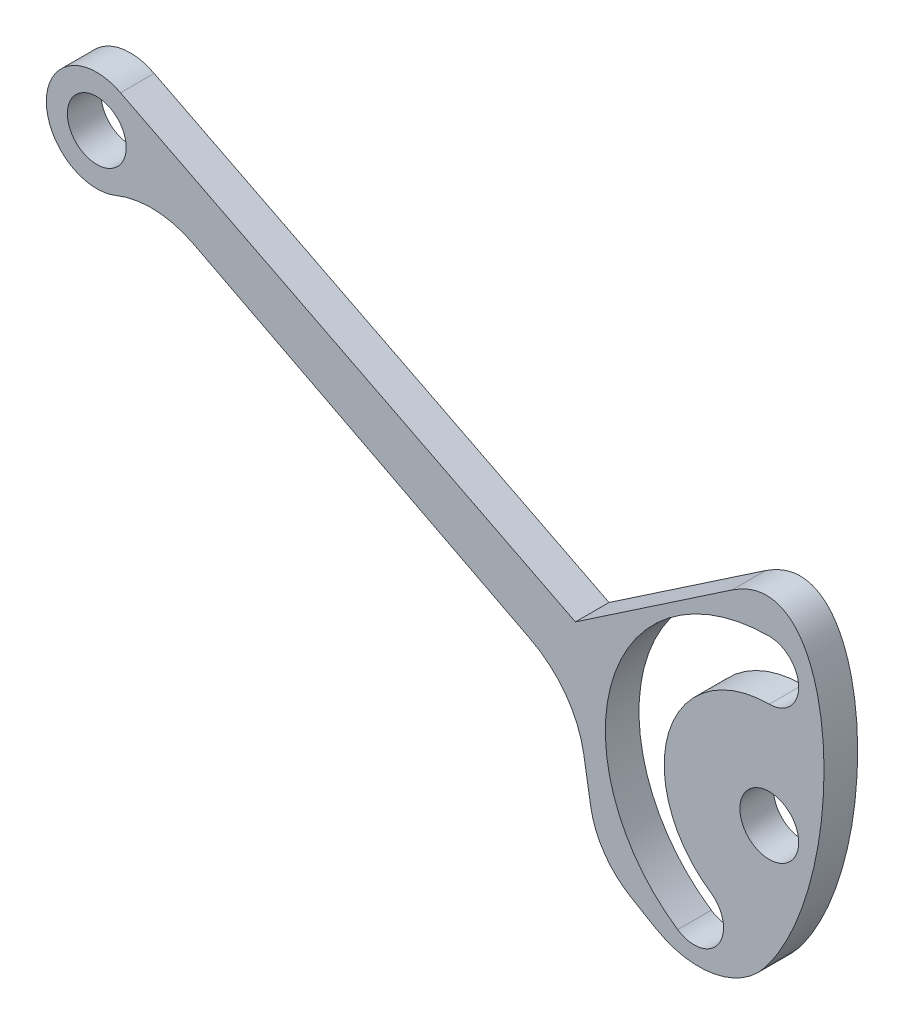
ISO-10303-21;
HEADER;
FILE_DESCRIPTION(('STEP AP214'),'2;1');
FILE_NAME('part.step','',(''),(''),'','','');
FILE_SCHEMA(('AUTOMOTIVE_DESIGN { 1 0 10303 214 1 1 1 1 }'));
ENDSEC;
DATA;
#1=APPLICATION_CONTEXT('core data for automotive mechanical design processes');
#2=APPLICATION_PROTOCOL_DEFINITION('international standard','automotive_design',2000,#1);
#3=PRODUCT_CONTEXT('',#1,'mechanical');
#4=PRODUCT('Part','Part','',(#3));
#5=PRODUCT_RELATED_PRODUCT_CATEGORY('part','',(#4));
#6=PRODUCT_DEFINITION_FORMATION('','',#4);
#7=PRODUCT_DEFINITION_CONTEXT('part definition',#1,'design');
#8=PRODUCT_DEFINITION('design','',#6,#7);
#9=PRODUCT_DEFINITION_SHAPE('','',#8);
#10=(LENGTH_UNIT() NAMED_UNIT(*) SI_UNIT(.MILLI.,.METRE.));
#11=(NAMED_UNIT(*) PLANE_ANGLE_UNIT() SI_UNIT($,.RADIAN.));
#12=(NAMED_UNIT(*) SI_UNIT($,.STERADIAN.) SOLID_ANGLE_UNIT());
#13=UNCERTAINTY_MEASURE_WITH_UNIT(LENGTH_MEASURE(1.E-05),#10,'distance_accuracy_value','');
#14=(GEOMETRIC_REPRESENTATION_CONTEXT(3) GLOBAL_UNCERTAINTY_ASSIGNED_CONTEXT((#13)) GLOBAL_UNIT_ASSIGNED_CONTEXT((#10,
#11,#12)) REPRESENTATION_CONTEXT('',''));
#15=CARTESIAN_POINT('',(0.,0.,0.));
#16=DIRECTION('',(0.,0.,1.));
#17=DIRECTION('',(1.,0.,0.));
#18=AXIS2_PLACEMENT_3D('',#15,#16,#17);
#19=CARTESIAN_POINT('',(53.3622225336022,-18.5930034133223,3.00024319840567));
#20=DIRECTION('',(0.,0.,-1.));
#21=DIRECTION('',(-1.,0.,0.));
#22=AXIS2_PLACEMENT_3D('',#19,#20,#21);
#23=CYLINDRICAL_SURFACE('',#22,19.5);
#24=CARTESIAN_POINT('',(53.3622225336022,-18.5930034133223,-0.99975680159433));
#25=DIRECTION('',(0.,0.,1.));
#26=DIRECTION('',(1.,0.,0.));
#27=AXIS2_PLACEMENT_3D('',#24,#25,#26);
#28=CIRCLE('',#27,19.5);
#29=CARTESIAN_POINT('',(53.3622225336021,0.906996586677682,-0.99975680159433));
#30=VERTEX_POINT('',#29);
#31=CARTESIAN_POINT('',(42.4648402712409,-34.7638741328591,-0.99975680159433));
#32=VERTEX_POINT('',#31);
#33=EDGE_CURVE('E268',#30,#32,#28,.T.);
#34=ORIENTED_EDGE('',*,*,#33,.F.);
#35=DIRECTION('',(0.,0.,-1.));
#36=VECTOR('',#35,1.);
#37=CARTESIAN_POINT('',(53.3622225336021,0.906996586677682,3.00024319840567));
#38=LINE('',#37,#36);
#39=CARTESIAN_POINT('',(53.3622225336021,0.906996586677682,3.00024319840567));
#40=VERTEX_POINT('',#39);
#41=EDGE_CURVE('E287',#40,#30,#38,.T.);
#42=ORIENTED_EDGE('',*,*,#41,.F.);
#43=CARTESIAN_POINT('',(53.3622225336022,-18.5930034133223,3.00024319840567));
#44=DIRECTION('',(0.,0.,1.));
#45=DIRECTION('',(1.,0.,0.));
#46=AXIS2_PLACEMENT_3D('',#43,#44,#45);
#47=CIRCLE('',#46,19.5);
#48=CARTESIAN_POINT('',(42.4648402712409,-34.7638741328591,3.00024319840567));
#49=VERTEX_POINT('',#48);
#50=EDGE_CURVE('E323',#40,#49,#47,.T.);
#51=ORIENTED_EDGE('',*,*,#50,.T.);
#52=DIRECTION('',(0.,0.,-1.));
#53=VECTOR('',#52,1.);
#54=CARTESIAN_POINT('',(42.4648402712409,-34.7638741328591,3.00024319840567));
#55=LINE('',#54,#53);
#56=EDGE_CURVE('E157',#49,#32,#55,.T.);
#57=ORIENTED_EDGE('',*,*,#56,.T.);
#58=EDGE_LOOP('',(#34,#42,#51,#57));
#59=FACE_BOUND('',#58,.T.);
#60=ADVANCED_FACE('F39',(#59),#23,.F.);
#61=CARTESIAN_POINT('',(53.3622225336022,-2.59300341332232,3.00024319840567));
#62=DIRECTION('',(0.,0.,-1.));
#63=DIRECTION('',(-1.,0.,0.));
#64=AXIS2_PLACEMENT_3D('',#61,#62,#63);
#65=CYLINDRICAL_SURFACE('',#64,3.5);
#66=CARTESIAN_POINT('',(53.3622225336022,-2.59300341332232,-0.99975680159433));
#67=DIRECTION('',(0.,0.,1.));
#68=DIRECTION('',(1.,0.,0.));
#69=AXIS2_PLACEMENT_3D('',#66,#67,#68);
#70=CIRCLE('',#69,3.5);
#71=CARTESIAN_POINT('',(53.3622225336022,-6.09300341332231,-0.99975680159433));
#72=VERTEX_POINT('',#71);
#73=EDGE_CURVE('E271',#72,#30,#70,.T.);
#74=ORIENTED_EDGE('',*,*,#73,.F.);
#75=DIRECTION('',(0.,0.,-1.));
#76=VECTOR('',#75,1.);
#77=CARTESIAN_POINT('',(53.3622225336022,-6.09300341332231,3.00024319840567));
#78=LINE('',#77,#76);
#79=CARTESIAN_POINT('',(53.3622225336022,-6.09300341332231,3.00024319840567));
#80=VERTEX_POINT('',#79);
#81=EDGE_CURVE('E285',#80,#72,#78,.T.);
#82=ORIENTED_EDGE('',*,*,#81,.F.);
#83=CARTESIAN_POINT('',(53.3622225336022,-2.59300341332232,3.00024319840567));
#84=DIRECTION('',(0.,0.,1.));
#85=DIRECTION('',(1.,0.,0.));
#86=AXIS2_PLACEMENT_3D('',#83,#84,#85);
#87=CIRCLE('',#86,3.5);
#88=EDGE_CURVE('E343',#80,#40,#87,.T.);
#89=ORIENTED_EDGE('',*,*,#88,.T.);
#90=ORIENTED_EDGE('',*,*,#41,.T.);
#91=EDGE_LOOP('',(#74,#82,#89,#90));
#92=FACE_BOUND('',#91,.T.);
#93=ADVANCED_FACE('F204',(#92),#65,.F.);
#94=CARTESIAN_POINT('',(53.3622225336022,-18.5930034133223,3.00024319840567));
#95=DIRECTION('',(0.,0.,-1.));
#96=DIRECTION('',(-1.,0.,0.));
#97=AXIS2_PLACEMENT_3D('',#94,#95,#96);
#98=CYLINDRICAL_SURFACE('',#97,12.5);
#99=CARTESIAN_POINT('',(53.3622225336022,-18.5930034133223,-0.99975680159433));
#100=DIRECTION('',(0.,0.,1.));
#101=DIRECTION('',(1.,0.,0.));
#102=AXIS2_PLACEMENT_3D('',#99,#100,#101);
#103=CIRCLE('',#102,12.5);
#104=CARTESIAN_POINT('',(46.3767210833706,-28.9589461822562,-0.99975680159433));
#105=VERTEX_POINT('',#104);
#106=EDGE_CURVE('E274',#72,#105,#103,.T.);
#107=ORIENTED_EDGE('',*,*,#106,.T.);
#108=DIRECTION('',(0.,0.,-1.));
#109=VECTOR('',#108,1.);
#110=CARTESIAN_POINT('',(46.3767210833706,-28.9589461822562,3.00024319840567));
#111=LINE('',#110,#109);
#112=CARTESIAN_POINT('',(46.3767210833706,-28.9589461822562,3.00024319840567));
#113=VERTEX_POINT('',#112);
#114=EDGE_CURVE('E283',#113,#105,#111,.T.);
#115=ORIENTED_EDGE('',*,*,#114,.F.);
#116=CARTESIAN_POINT('',(53.3622225336022,-18.5930034133223,3.00024319840567));
#117=DIRECTION('',(0.,0.,1.));
#118=DIRECTION('',(1.,0.,0.));
#119=AXIS2_PLACEMENT_3D('',#116,#117,#118);
#120=CIRCLE('',#119,12.5);
#121=EDGE_CURVE('E341',#80,#113,#120,.T.);
#122=ORIENTED_EDGE('',*,*,#121,.F.);
#123=ORIENTED_EDGE('',*,*,#81,.T.);
#124=EDGE_LOOP('',(#107,#115,#122,#123));
#125=FACE_BOUND('',#124,.T.);
#126=ADVANCED_FACE('F186',(#125),#98,.T.);
#127=CARTESIAN_POINT('',(48.9112840875932,3.4474715664343,3.00024319840567));
#128=CARTESIAN_POINT('',(64.5561314291227,14.0353255903437,3.00024319840567));
#129=CARTESIAN_POINT('',(63.6464675976069,-34.3525709423229,3.00024319840567));
#130=CARTESIAN_POINT('',(45.0012350032019,-38.941044242468,3.00024319840567));
#131=B_SPLINE_CURVE_WITH_KNOTS('',3,(#127,#128,#129,#130),.UNSPECIFIED.,.F.,.F.,(4,4),(0.,1.),.UNSPECIFIED.);
#132=DIRECTION('',(0.,0.,-1.));
#133=VECTOR('',#132,1.);
#134=SURFACE_OF_LINEAR_EXTRUSION('',#131,#133);
#135=CARTESIAN_POINT('',(48.9112840875932,3.44747156643431,3.00024319840567));
#136=VERTEX_POINT('',#135);
#137=CARTESIAN_POINT('',(52.8256575757471,-33.5054785391879,3.00024319840567));
#138=VERTEX_POINT('',#137);
#139=EDGE_CURVE('E151',#136,#138,#131,.T.);
#140=ORIENTED_EDGE('',*,*,#139,.T.);
#141=DIRECTION('',(0.,0.,-1.));
#142=VECTOR('',#141,1.);
#143=CARTESIAN_POINT('',(52.8256575757471,-33.5054785391879,3.00024319840567));
#144=LINE('',#143,#142);
#145=CARTESIAN_POINT('',(52.8256575757471,-33.5054785391879,-0.99975680159433));
#146=VERTEX_POINT('',#145);
#147=EDGE_CURVE('E308',#138,#146,#144,.T.);
#148=ORIENTED_EDGE('',*,*,#147,.T.);
#149=CARTESIAN_POINT('',(48.9112840875932,3.4474715664343,-0.99975680159433));
#150=CARTESIAN_POINT('',(64.5561314291227,14.0353255903437,-0.99975680159433));
#151=CARTESIAN_POINT('',(63.6464675976069,-34.3525709423229,-0.99975680159433));
#152=CARTESIAN_POINT('',(45.0012350032019,-38.941044242468,-0.99975680159433));
#153=B_SPLINE_CURVE_WITH_KNOTS('',3,(#149,#150,#151,#152),.UNSPECIFIED.,.F.,.F.,(4,4),(0.,1.),.UNSPECIFIED.);
#154=CARTESIAN_POINT('',(48.9112840875932,3.44747156643431,-0.99975680159433));
#155=VERTEX_POINT('',#154);
#156=EDGE_CURVE('E154',#155,#146,#153,.T.);
#157=ORIENTED_EDGE('',*,*,#156,.F.);
#158=DIRECTION('',(0.,0.,-1.));
#159=VECTOR('',#158,1.);
#160=CARTESIAN_POINT('',(48.9112840875932,3.44747156643431,3.00024319840567));
#161=LINE('',#160,#159);
#162=EDGE_CURVE('E146',#136,#155,#161,.T.);
#163=ORIENTED_EDGE('',*,*,#162,.F.);
#164=EDGE_LOOP('',(#140,#148,#157,#163));
#165=FACE_BOUND('',#164,.T.);
#166=ADVANCED_FACE('F148',(#165),#134,.T.);
#167=CARTESIAN_POINT('',(-0.296927544031007,-29.8548259989917,3.00024319840567));
#168=DIRECTION('',(0.560475503244896,-0.828171003031609,0.));
#169=DIRECTION('',(0.828171003031609,0.560475503244896,0.));
#170=AXIS2_PLACEMENT_3D('',#167,#168,#169);
#171=PLANE('',#170);
#172=DIRECTION('',(-0.828171003031609,-0.560475503244896,0.));
#173=VECTOR('',#172,1.);
#174=CARTESIAN_POINT('',(-0.296927544031007,-29.8548259989917,-0.99975680159433));
#175=LINE('',#174,#173);
#176=CARTESIAN_POINT('',(30.3013682089671,-9.1470311742274,-0.99975680159433));
#177=VERTEX_POINT('',#176);
#178=EDGE_CURVE('E247',#155,#177,#175,.T.);
#179=ORIENTED_EDGE('',*,*,#178,.T.);
#180=DIRECTION('',(0.,0.,-1.));
#181=VECTOR('',#180,1.);
#182=CARTESIAN_POINT('',(30.3013682089671,-9.1470311742274,3.00024319840567));
#183=LINE('',#182,#181);
#184=CARTESIAN_POINT('',(30.3013682089671,-9.1470311742274,3.00024319840567));
#185=VERTEX_POINT('',#184);
#186=EDGE_CURVE('E158',#185,#177,#183,.T.);
#187=ORIENTED_EDGE('',*,*,#186,.F.);
#188=DIRECTION('',(-0.828171003031609,-0.560475503244896,0.));
#189=VECTOR('',#188,1.);
#190=CARTESIAN_POINT('',(-0.296927544031007,-29.8548259989917,3.00024319840567));
#191=LINE('',#190,#189);
#192=EDGE_CURVE('E161',#136,#185,#191,.T.);
#193=ORIENTED_EDGE('',*,*,#192,.F.);
#194=ORIENTED_EDGE('',*,*,#162,.T.);
#195=EDGE_LOOP('',(#179,#187,#193,#194));
#196=FACE_BOUND('',#195,.T.);
#197=ADVANCED_FACE('F162',(#196),#171,.F.);
#198=CARTESIAN_POINT('',(-22.3347593661699,17.5506595408576,3.00024319840567));
#199=DIRECTION('',(-0.452351957288991,-0.89183950727517,0.));
#200=DIRECTION('',(0.891839507275171,-0.452351957288991,0.));
#201=AXIS2_PLACEMENT_3D('',#198,#199,#200);
#202=PLANE('',#201);
#203=DIRECTION('',(-0.891839507275171,0.452351957288991,0.));
#204=VECTOR('',#203,1.);
#205=CARTESIAN_POINT('',(-22.3347593661699,17.5506595408576,-0.99975680159433));
#206=LINE('',#205,#204);
#207=CARTESIAN_POINT('',(-23.8127331369104,18.3003059991748,-0.99975680159433));
#208=VERTEX_POINT('',#207);
#209=EDGE_CURVE('E240',#177,#208,#206,.T.);
#210=ORIENTED_EDGE('',*,*,#209,.T.);
#211=DIRECTION('',(0.,0.,-1.));
#212=VECTOR('',#211,1.);
#213=CARTESIAN_POINT('',(-23.8127331369104,18.3003059991748,3.00024319840567));
#214=LINE('',#213,#212);
#215=CARTESIAN_POINT('',(-23.8127331369104,18.3003059991748,3.00024319840567));
#216=VERTEX_POINT('',#215);
#217=EDGE_CURVE('E242',#216,#208,#214,.T.);
#218=ORIENTED_EDGE('',*,*,#217,.F.);
#219=DIRECTION('',(-0.891839507275171,0.452351957288991,0.));
#220=VECTOR('',#219,1.);
#221=CARTESIAN_POINT('',(-22.3347593661699,17.5506595408576,3.00024319840567));
#222=LINE('',#221,#220);
#223=EDGE_CURVE('E165',#185,#216,#222,.T.);
#224=ORIENTED_EDGE('',*,*,#223,.F.);
#225=ORIENTED_EDGE('',*,*,#186,.T.);
#226=EDGE_LOOP('',(#210,#218,#224,#225));
#227=FACE_BOUND('',#226,.T.);
#228=ADVANCED_FACE('F231',(#227),#202,.F.);
#229=CARTESIAN_POINT('',(-26.6377774663978,13.0069965866777,3.00024319840567));
#230=DIRECTION('',(0.,0.,-1.));
#231=DIRECTION('',(-1.,0.,0.));
#232=AXIS2_PLACEMENT_3D('',#229,#230,#231);
#233=CYLINDRICAL_SURFACE('',#232,6.);
#234=CARTESIAN_POINT('',(-26.6377774663978,13.0069965866777,-0.99975680159433));
#235=DIRECTION('',(0.,0.,1.));
#236=DIRECTION('',(1.,0.,0.));
#237=AXIS2_PLACEMENT_3D('',#234,#235,#236);
#238=CIRCLE('',#237,6.);
#239=CARTESIAN_POINT('',(-24.3515258199539,7.45965006702232,-0.99975680159433));
#240=VERTEX_POINT('',#239);
#241=EDGE_CURVE('E246',#208,#240,#238,.T.);
#242=ORIENTED_EDGE('',*,*,#241,.T.);
#243=DIRECTION('',(0.,0.,-1.));
#244=VECTOR('',#243,1.);
#245=CARTESIAN_POINT('',(-24.3515258199539,7.45965006702232,3.00024319840567));
#246=LINE('',#245,#244);
#247=CARTESIAN_POINT('',(-24.3515258199539,7.45965006702232,3.00024319840567));
#248=VERTEX_POINT('',#247);
#249=EDGE_CURVE('E303',#240,#248,#246,.F.);
#250=ORIENTED_EDGE('',*,*,#249,.T.);
#251=CARTESIAN_POINT('',(-26.6377774663978,13.0069965866777,3.00024319840567));
#252=DIRECTION('',(0.,0.,1.));
#253=DIRECTION('',(1.,0.,0.));
#254=AXIS2_PLACEMENT_3D('',#251,#252,#253);
#255=CIRCLE('',#254,6.);
#256=EDGE_CURVE('E252',#216,#248,#255,.T.);
#257=ORIENTED_EDGE('',*,*,#256,.F.);
#258=ORIENTED_EDGE('',*,*,#217,.T.);
#259=EDGE_LOOP('',(#242,#250,#257,#258));
#260=FACE_BOUND('',#259,.T.);
#261=ADVANCED_FACE('F228',(#260),#233,.T.);
#262=CARTESIAN_POINT('',(-25.0327111099178,12.1792146005857,3.00024319840567));
#263=DIRECTION('',(-0.458363339267844,-0.888764900980699,0.));
#264=DIRECTION('',(0.888764900980699,-0.458363339267844,0.));
#265=AXIS2_PLACEMENT_3D('',#262,#263,#264);
#266=PLANE('',#265);
#267=DIRECTION('',(-0.888764900980699,0.458363339267844,0.));
#268=VECTOR('',#267,1.);
#269=CARTESIAN_POINT('',(-25.0327111099178,12.1792146005857,3.00024319840567));
#270=LINE('',#269,#268);
#271=CARTESIAN_POINT('',(24.958095266159,-13.602578669993,3.00024319840567));
#272=VERTEX_POINT('',#271);
#273=CARTESIAN_POINT('',(-15.1180677361937,7.06592869177519,3.00024319840567));
#274=VERTEX_POINT('',#273);
#275=EDGE_CURVE('E349',#272,#274,#270,.T.);
#276=ORIENTED_EDGE('',*,*,#275,.T.);
#277=DIRECTION('',(0.,0.,-1.));
#278=VECTOR('',#277,1.);
#279=CARTESIAN_POINT('',(-15.1180677361937,7.06592869177519,3.00024319840567));
#280=LINE('',#279,#278);
#281=CARTESIAN_POINT('',(-15.1180677361937,7.06592869177519,-0.99975680159433));
#282=VERTEX_POINT('',#281);
#283=EDGE_CURVE('E300',#274,#282,#280,.T.);
#284=ORIENTED_EDGE('',*,*,#283,.T.);
#285=DIRECTION('',(-0.888764900980699,0.458363339267844,0.));
#286=VECTOR('',#285,1.);
#287=CARTESIAN_POINT('',(-25.0327111099178,12.1792146005857,-0.99975680159433));
#288=LINE('',#287,#286);
#289=CARTESIAN_POINT('',(24.958095266159,-13.602578669993,-0.99975680159433));
#290=VERTEX_POINT('',#289);
#291=EDGE_CURVE('E258',#290,#282,#288,.T.);
#292=ORIENTED_EDGE('',*,*,#291,.F.);
#293=DIRECTION('',(0.,0.,-1.));
#294=VECTOR('',#293,1.);
#295=CARTESIAN_POINT('',(24.958095266159,-13.602578669993,3.00024319840567));
#296=LINE('',#295,#294);
#297=EDGE_CURVE('E293',#290,#272,#296,.F.);
#298=ORIENTED_EDGE('',*,*,#297,.T.);
#299=EDGE_LOOP('',(#276,#284,#292,#298));
#300=FACE_BOUND('',#299,.T.);
#301=ADVANCED_FACE('F225',(#300),#266,.T.);
#302=CARTESIAN_POINT('',(24.6140359275723,17.6404420919175,3.00024319840567));
#303=DIRECTION('',(-0.986295519770452,-0.16498832589227,0.));
#304=DIRECTION('',(0.16498832589227,-0.986295519770452,0.));
#305=AXIS2_PLACEMENT_3D('',#302,#303,#304);
#306=PLANE('',#305);
#307=DIRECTION('',(-0.16498832589227,0.986295519770452,0.));
#308=VECTOR('',#307,1.);
#309=CARTESIAN_POINT('',(24.6140359275723,17.6404420919175,-0.99975680159433));
#310=LINE('',#309,#308);
#311=CARTESIAN_POINT('',(32.1221446101194,-27.2428180751144,-0.99975680159433));
#312=VERTEX_POINT('',#311);
#313=CARTESIAN_POINT('',(31.2932814321903,-22.2878975710542,-0.99975680159433));
#314=VERTEX_POINT('',#313);
#315=EDGE_CURVE('E260',#312,#314,#310,.T.);
#316=ORIENTED_EDGE('',*,*,#315,.F.);
#317=DIRECTION('',(0.,0.,-1.));
#318=VECTOR('',#317,1.);
#319=CARTESIAN_POINT('',(32.1221446101194,-27.2428180751144,3.00024319840567));
#320=LINE('',#319,#318);
#321=CARTESIAN_POINT('',(32.1221446101194,-27.2428180751144,3.00024319840567));
#322=VERTEX_POINT('',#321);
#323=EDGE_CURVE('E11',#312,#322,#320,.F.);
#324=ORIENTED_EDGE('',*,*,#323,.T.);
#325=DIRECTION('',(-0.16498832589227,0.986295519770452,0.));
#326=VECTOR('',#325,1.);
#327=CARTESIAN_POINT('',(24.6140359275723,17.6404420919175,3.00024319840567));
#328=LINE('',#327,#326);
#329=CARTESIAN_POINT('',(31.2932814321903,-22.2878975710542,3.00024319840567));
#330=VERTEX_POINT('',#329);
#331=EDGE_CURVE('E324',#322,#330,#328,.T.);
#332=ORIENTED_EDGE('',*,*,#331,.T.);
#333=DIRECTION('',(0.,0.,-1.));
#334=VECTOR('',#333,1.);
#335=CARTESIAN_POINT('',(31.2932814321903,-22.2878975710542,-0.99975680159433));
#336=LINE('',#335,#334);
#337=EDGE_CURVE('E288',#330,#314,#336,.T.);
#338=ORIENTED_EDGE('',*,*,#337,.T.);
#339=EDGE_LOOP('',(#316,#324,#332,#338));
#340=FACE_BOUND('',#339,.T.);
#341=ADVANCED_FACE('F221',(#340),#306,.T.);
#342=CARTESIAN_POINT('',(53.3622225336022,-18.5930034133223,3.00024319840567));
#343=DIRECTION('',(0.,0.,-1.));
#344=DIRECTION('',(-1.,0.,0.));
#345=AXIS2_PLACEMENT_3D('',#342,#343,#344);
#346=CYLINDRICAL_SURFACE('',#345,3.50000000000001);
#347=CARTESIAN_POINT('',(53.3622225336022,-18.5930034133223,3.00024319840567));
#348=DIRECTION('',(0.,0.,1.));
#349=DIRECTION('',(1.,0.,0.));
#350=AXIS2_PLACEMENT_3D('',#347,#348,#349);
#351=CIRCLE('',#350,3.50000000000001);
#352=CARTESIAN_POINT('',(56.8622225336022,-18.5930034133223,3.00024319840567));
#353=VERTEX_POINT('',#352);
#354=EDGE_CURVE('E335',#353,#353,#351,.T.);
#355=ORIENTED_EDGE('',*,*,#354,.T.);
#356=EDGE_LOOP('',(#355));
#357=FACE_BOUND('',#356,.T.);
#358=CARTESIAN_POINT('',(53.3622225336022,-18.5930034133223,-0.99975680159433));
#359=DIRECTION('',(0.,0.,1.));
#360=DIRECTION('',(1.,0.,0.));
#361=AXIS2_PLACEMENT_3D('',#358,#359,#360);
#362=CIRCLE('',#361,3.50000000000001);
#363=CARTESIAN_POINT('',(56.8622225336022,-18.5930034133223,-0.99975680159433));
#364=VERTEX_POINT('',#363);
#365=EDGE_CURVE('E173',#364,#364,#362,.T.);
#366=ORIENTED_EDGE('',*,*,#365,.F.);
#367=EDGE_LOOP('',(#366));
#368=FACE_BOUND('',#367,.T.);
#369=ADVANCED_FACE('F224',(#357,#368),#346,.F.);
#370=CARTESIAN_POINT('',(44.4207806773057,-31.8614101575577,3.00024319840567));
#371=DIRECTION('',(0.,0.,-1.));
#372=DIRECTION('',(-1.,0.,0.));
#373=AXIS2_PLACEMENT_3D('',#370,#371,#372);
#374=CYLINDRICAL_SURFACE('',#373,3.50000000000001);
#375=CARTESIAN_POINT('',(44.4207806773057,-31.8614101575577,-0.99975680159433));
#376=DIRECTION('',(0.,0.,1.));
#377=DIRECTION('',(1.,0.,0.));
#378=AXIS2_PLACEMENT_3D('',#375,#376,#377);
#379=CIRCLE('',#378,3.50000000000001);
#380=EDGE_CURVE('E277',#32,#105,#379,.T.);
#381=ORIENTED_EDGE('',*,*,#380,.F.);
#382=ORIENTED_EDGE('',*,*,#56,.F.);
#383=CARTESIAN_POINT('',(44.4207806773057,-31.8614101575577,3.00024319840567));
#384=DIRECTION('',(0.,0.,1.));
#385=DIRECTION('',(1.,0.,0.));
#386=AXIS2_PLACEMENT_3D('',#383,#384,#385);
#387=CIRCLE('',#386,3.50000000000001);
#388=EDGE_CURVE('E338',#49,#113,#387,.T.);
#389=ORIENTED_EDGE('',*,*,#388,.T.);
#390=ORIENTED_EDGE('',*,*,#114,.T.);
#391=EDGE_LOOP('',(#381,#382,#389,#390));
#392=FACE_BOUND('',#391,.T.);
#393=ADVANCED_FACE('F219',(#392),#374,.F.);
#394=CARTESIAN_POINT('',(-29.3024556513201,4.51027862043727,3.00024319840567));
#395=DIRECTION('',(-0.504802581440616,-0.863234819600606,0.));
#396=DIRECTION('',(0.863234819600606,-0.504802581440616,0.));
#397=AXIS2_PLACEMENT_3D('',#394,#395,#396);
#398=PLANE('',#397);
#399=DIRECTION('',(-0.863234819600606,0.504802581440616,0.));
#400=VECTOR('',#399,1.);
#401=CARTESIAN_POINT('',(-29.3024556513201,4.51027862043727,-0.99975680159433));
#402=LINE('',#401,#400);
#403=CARTESIAN_POINT('',(39.9107991887707,-35.9642584578403,-0.99975680159433));
#404=VERTEX_POINT('',#403);
#405=CARTESIAN_POINT('',(36.9370739934178,-34.2252830121978,-0.99975680159433));
#406=VERTEX_POINT('',#405);
#407=EDGE_CURVE('E265',#404,#406,#402,.T.);
#408=ORIENTED_EDGE('',*,*,#407,.F.);
#409=DIRECTION('',(0.,0.,-1.));
#410=VECTOR('',#409,1.);
#411=CARTESIAN_POINT('',(39.9107991887706,-35.9642584578403,3.00024319840567));
#412=LINE('',#411,#410);
#413=CARTESIAN_POINT('',(39.9107991887707,-35.9642584578403,3.00024319840567));
#414=VERTEX_POINT('',#413);
#415=EDGE_CURVE('E317',#404,#414,#412,.F.);
#416=ORIENTED_EDGE('',*,*,#415,.T.);
#417=DIRECTION('',(-0.863234819600606,0.504802581440616,0.));
#418=VECTOR('',#417,1.);
#419=CARTESIAN_POINT('',(-29.3024556513201,4.51027862043727,3.00024319840567));
#420=LINE('',#419,#418);
#421=CARTESIAN_POINT('',(36.9370739934178,-34.2252830121978,3.00024319840567));
#422=VERTEX_POINT('',#421);
#423=EDGE_CURVE('E321',#414,#422,#420,.T.);
#424=ORIENTED_EDGE('',*,*,#423,.T.);
#425=DIRECTION('',(0.,0.,-1.));
#426=VECTOR('',#425,1.);
#427=CARTESIAN_POINT('',(36.9370739934177,-34.2252830121978,3.00024319840567));
#428=LINE('',#427,#426);
#429=EDGE_CURVE('E314',#422,#406,#428,.T.);
#430=ORIENTED_EDGE('',*,*,#429,.T.);
#431=EDGE_LOOP('',(#408,#416,#424,#430));
#432=FACE_BOUND('',#431,.T.);
#433=ADVANCED_FACE('F215',(#432),#398,.T.);
#434=CARTESIAN_POINT('',(-26.6377774663978,13.0069965866777,3.00024319840567));
#435=DIRECTION('',(0.,0.,-1.));
#436=DIRECTION('',(-1.,0.,0.));
#437=AXIS2_PLACEMENT_3D('',#434,#435,#436);
#438=CYLINDRICAL_SURFACE('',#437,3.5);
#439=CARTESIAN_POINT('',(-26.6377774663978,13.0069965866777,3.00024319840567));
#440=DIRECTION('',(0.,0.,1.));
#441=DIRECTION('',(1.,0.,0.));
#442=AXIS2_PLACEMENT_3D('',#439,#440,#441);
#443=CIRCLE('',#442,3.5);
#444=CARTESIAN_POINT('',(-23.1377774663978,13.0069965866777,3.00024319840567));
#445=VERTEX_POINT('',#444);
#446=EDGE_CURVE('E253',#445,#445,#443,.T.);
#447=ORIENTED_EDGE('',*,*,#446,.T.);
#448=EDGE_LOOP('',(#447));
#449=FACE_BOUND('',#448,.T.);
#450=CARTESIAN_POINT('',(-26.6377774663978,13.0069965866777,-0.99975680159433));
#451=DIRECTION('',(0.,0.,1.));
#452=DIRECTION('',(1.,0.,0.));
#453=AXIS2_PLACEMENT_3D('',#450,#451,#452);
#454=CIRCLE('',#453,3.5);
#455=CARTESIAN_POINT('',(-23.1377774663978,13.0069965866777,-0.99975680159433));
#456=VERTEX_POINT('',#455);
#457=EDGE_CURVE('E170',#456,#456,#454,.T.);
#458=ORIENTED_EDGE('',*,*,#457,.F.);
#459=EDGE_LOOP('',(#458));
#460=FACE_BOUND('',#459,.T.);
#461=ADVANCED_FACE('F218',(#449,#460),#438,.F.);
#462=CARTESIAN_POINT('',(-26.6377774663978,9.06699658667768,3.00024319840567));
#463=DIRECTION('',(0.,0.,1.));
#464=DIRECTION('',(1.,0.,0.));
#465=AXIS2_PLACEMENT_3D('',#462,#463,#464);
#466=PLANE('',#465);
#467=ORIENTED_EDGE('',*,*,#423,.F.);
#468=CARTESIAN_POINT('',(44.9588250031768,-27.3319102618343,3.00024319840567));
#469=DIRECTION('',(0.,0.,1.));
#470=DIRECTION('',(1.,0.,0.));
#471=AXIS2_PLACEMENT_3D('',#468,#469,#470);
#472=CIRCLE('',#471,10.);
#473=EDGE_CURVE('E47',#414,#138,#472,.T.);
#474=ORIENTED_EDGE('',*,*,#473,.T.);
#475=ORIENTED_EDGE('',*,*,#139,.F.);
#476=ORIENTED_EDGE('',*,*,#192,.T.);
#477=ORIENTED_EDGE('',*,*,#223,.T.);
#478=ORIENTED_EDGE('',*,*,#256,.T.);
#479=CARTESIAN_POINT('',(-20.16006446814,-2.7104852190125,3.00024319840567));
#480=DIRECTION('',(0.,0.,1.));
#481=DIRECTION('',(1.,0.,0.));
#482=AXIS2_PLACEMENT_3D('',#479,#480,#481);
#483=CIRCLE('',#482,11.);
#484=EDGE_CURVE('E306',#248,#274,#483,.F.);
#485=ORIENTED_EDGE('',*,*,#484,.T.);
#486=ORIENTED_EDGE('',*,*,#275,.F.);
#487=CARTESIAN_POINT('',(19.4577351949448,-24.2677574817614,3.00024319840567));
#488=DIRECTION('',(0.,0.,1.));
#489=DIRECTION('',(1.,0.,0.));
#490=AXIS2_PLACEMENT_3D('',#487,#488,#489);
#491=CIRCLE('',#490,12.);
#492=EDGE_CURVE('E297',#272,#330,#491,.F.);
#493=ORIENTED_EDGE('',*,*,#492,.T.);
#494=ORIENTED_EDGE('',*,*,#331,.F.);
#495=CARTESIAN_POINT('',(41.9850998078239,-25.5929348161917,3.00024319840567));
#496=DIRECTION('',(0.,0.,1.));
#497=DIRECTION('',(1.,0.,0.));
#498=AXIS2_PLACEMENT_3D('',#495,#496,#497);
#499=CIRCLE('',#498,10.);
#500=EDGE_CURVE('E59',#322,#422,#499,.T.);
#501=ORIENTED_EDGE('',*,*,#500,.T.);
#502=EDGE_LOOP('',(#467,#474,#475,#476,#477,#478,#485,#486,#493,#494,#501));
#503=FACE_BOUND('',#502,.T.);
#504=ORIENTED_EDGE('',*,*,#50,.F.);
#505=ORIENTED_EDGE('',*,*,#88,.F.);
#506=ORIENTED_EDGE('',*,*,#121,.T.);
#507=ORIENTED_EDGE('',*,*,#388,.F.);
#508=EDGE_LOOP('',(#504,#505,#506,#507));
#509=FACE_BOUND('',#508,.T.);
#510=ORIENTED_EDGE('',*,*,#354,.F.);
#511=EDGE_LOOP('',(#510));
#512=FACE_BOUND('',#511,.T.);
#513=ORIENTED_EDGE('',*,*,#446,.F.);
#514=EDGE_LOOP('',(#513));
#515=FACE_BOUND('',#514,.T.);
#516=ADVANCED_FACE('F167',(#503,#509,#512,#515),#466,.T.);
#517=CARTESIAN_POINT('',(-26.6377774663978,9.06699658667768,-0.99975680159433));
#518=DIRECTION('',(0.,0.,1.));
#519=DIRECTION('',(1.,0.,0.));
#520=AXIS2_PLACEMENT_3D('',#517,#518,#519);
#521=PLANE('',#520);
#522=ORIENTED_EDGE('',*,*,#156,.T.);
#523=CARTESIAN_POINT('',(44.9588250031768,-27.3319102618343,-0.99975680159433));
#524=DIRECTION('',(0.,0.,1.));
#525=DIRECTION('',(1.,0.,0.));
#526=AXIS2_PLACEMENT_3D('',#523,#524,#525);
#527=CIRCLE('',#526,10.);
#528=EDGE_CURVE('E312',#146,#404,#527,.F.);
#529=ORIENTED_EDGE('',*,*,#528,.T.);
#530=ORIENTED_EDGE('',*,*,#407,.T.);
#531=CARTESIAN_POINT('',(41.9850998078239,-25.5929348161917,-0.99975680159433));
#532=DIRECTION('',(0.,0.,1.));
#533=DIRECTION('',(1.,0.,0.));
#534=AXIS2_PLACEMENT_3D('',#531,#532,#533);
#535=CIRCLE('',#534,10.);
#536=EDGE_CURVE('E310',#406,#312,#535,.F.);
#537=ORIENTED_EDGE('',*,*,#536,.T.);
#538=ORIENTED_EDGE('',*,*,#315,.T.);
#539=CARTESIAN_POINT('',(19.4577351949448,-24.2677574817614,-0.99975680159433));
#540=DIRECTION('',(0.,0.,1.));
#541=DIRECTION('',(1.,0.,0.));
#542=AXIS2_PLACEMENT_3D('',#539,#540,#541);
#543=CIRCLE('',#542,12.);
#544=EDGE_CURVE('E295',#314,#290,#543,.T.);
#545=ORIENTED_EDGE('',*,*,#544,.T.);
#546=ORIENTED_EDGE('',*,*,#291,.T.);
#547=CARTESIAN_POINT('',(-20.16006446814,-2.7104852190125,-0.99975680159433));
#548=DIRECTION('',(0.,0.,1.));
#549=DIRECTION('',(1.,0.,0.));
#550=AXIS2_PLACEMENT_3D('',#547,#548,#549);
#551=CIRCLE('',#550,11.);
#552=EDGE_CURVE('E257',#282,#240,#551,.T.);
#553=ORIENTED_EDGE('',*,*,#552,.T.);
#554=ORIENTED_EDGE('',*,*,#241,.F.);
#555=ORIENTED_EDGE('',*,*,#209,.F.);
#556=ORIENTED_EDGE('',*,*,#178,.F.);
#557=EDGE_LOOP('',(#522,#529,#530,#537,#538,#545,#546,#553,#554,#555,#556));
#558=FACE_BOUND('',#557,.T.);
#559=ORIENTED_EDGE('',*,*,#33,.T.);
#560=ORIENTED_EDGE('',*,*,#380,.T.);
#561=ORIENTED_EDGE('',*,*,#106,.F.);
#562=ORIENTED_EDGE('',*,*,#73,.T.);
#563=EDGE_LOOP('',(#559,#560,#561,#562));
#564=FACE_BOUND('',#563,.T.);
#565=ORIENTED_EDGE('',*,*,#365,.T.);
#566=EDGE_LOOP('',(#565));
#567=FACE_BOUND('',#566,.T.);
#568=ORIENTED_EDGE('',*,*,#457,.T.);
#569=EDGE_LOOP('',(#568));
#570=FACE_BOUND('',#569,.T.);
#571=ADVANCED_FACE('F192',(#558,#564,#567,#570),#521,.F.);
#572=CARTESIAN_POINT('',(19.4577351949448,-24.2677574817614,3.00024319840567));
#573=DIRECTION('',(0.,0.,1.));
#574=DIRECTION('',(1.,0.,0.));
#575=AXIS2_PLACEMENT_3D('',#572,#573,#574);
#576=CYLINDRICAL_SURFACE('',#575,12.);
#577=ORIENTED_EDGE('',*,*,#492,.F.);
#578=ORIENTED_EDGE('',*,*,#297,.F.);
#579=ORIENTED_EDGE('',*,*,#544,.F.);
#580=ORIENTED_EDGE('',*,*,#337,.F.);
#581=EDGE_LOOP('',(#577,#578,#579,#580));
#582=FACE_BOUND('',#581,.T.);
#583=ADVANCED_FACE('F188',(#582),#576,.F.);
#584=CARTESIAN_POINT('',(-20.16006446814,-2.7104852190125,3.00024319840567));
#585=DIRECTION('',(0.,0.,-1.));
#586=DIRECTION('',(-1.,0.,0.));
#587=AXIS2_PLACEMENT_3D('',#584,#585,#586);
#588=CYLINDRICAL_SURFACE('',#587,11.);
#589=ORIENTED_EDGE('',*,*,#484,.F.);
#590=ORIENTED_EDGE('',*,*,#249,.F.);
#591=ORIENTED_EDGE('',*,*,#552,.F.);
#592=ORIENTED_EDGE('',*,*,#283,.F.);
#593=EDGE_LOOP('',(#589,#590,#591,#592));
#594=FACE_BOUND('',#593,.T.);
#595=ADVANCED_FACE('F191',(#594),#588,.F.);
#596=CARTESIAN_POINT('',(44.9588250031768,-27.3319102618343,1.00024319840567));
#597=DIRECTION('',(0.,0.,-1.));
#598=DIRECTION('',(-1.,0.,0.));
#599=AXIS2_PLACEMENT_3D('',#596,#597,#598);
#600=CYLINDRICAL_SURFACE('',#599,10.);
#601=ORIENTED_EDGE('',*,*,#473,.F.);
#602=ORIENTED_EDGE('',*,*,#415,.F.);
#603=ORIENTED_EDGE('',*,*,#528,.F.);
#604=ORIENTED_EDGE('',*,*,#147,.F.);
#605=EDGE_LOOP('',(#601,#602,#603,#604));
#606=FACE_BOUND('',#605,.T.);
#607=ADVANCED_FACE('F195',(#606),#600,.T.);
#608=CARTESIAN_POINT('',(41.9850998078239,-25.5929348161917,3.00024319840567));
#609=DIRECTION('',(0.,0.,-1.));
#610=DIRECTION('',(-1.,0.,0.));
#611=AXIS2_PLACEMENT_3D('',#608,#609,#610);
#612=CYLINDRICAL_SURFACE('',#611,10.);
#613=ORIENTED_EDGE('',*,*,#500,.F.);
#614=ORIENTED_EDGE('',*,*,#323,.F.);
#615=ORIENTED_EDGE('',*,*,#536,.F.);
#616=ORIENTED_EDGE('',*,*,#429,.F.);
#617=EDGE_LOOP('',(#613,#614,#615,#616));
#618=FACE_BOUND('',#617,.T.);
#619=ADVANCED_FACE('F41',(#618),#612,.T.);
#620=CLOSED_SHELL('',(#60,#93,#126,#166,#197,#228,#261,#301,#341,#369,#393,#433,#461,#516,#571,
#583,#595,#607,#619));
#621=MANIFOLD_SOLID_BREP('B2',#620);
#622=ADVANCED_BREP_SHAPE_REPRESENTATION('',(#18,#621),#14);
#623=SHAPE_DEFINITION_REPRESENTATION(#9,#622);
ENDSEC;
END-ISO-10303-21;
